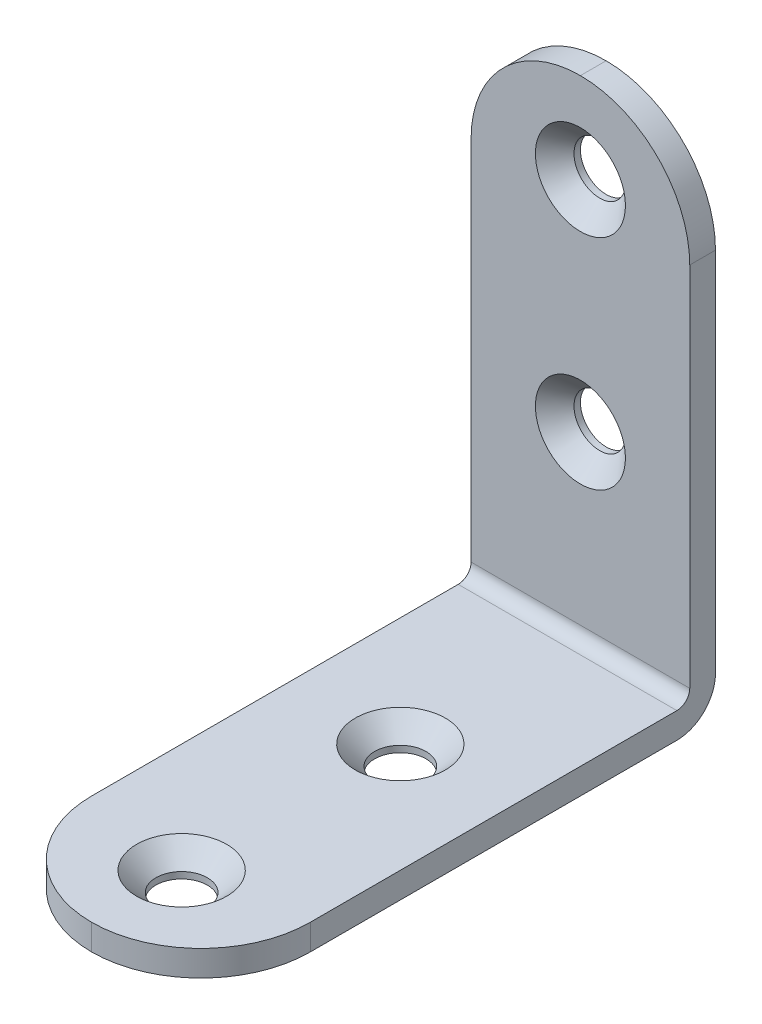
ISO-10303-21;
HEADER;
FILE_DESCRIPTION(('STEP AP214'),'2;1');
FILE_NAME('part.step','',(''),(''),'','','');
FILE_SCHEMA(('AUTOMOTIVE_DESIGN { 1 0 10303 214 1 1 1 1 }'));
ENDSEC;
DATA;
#1=APPLICATION_CONTEXT('core data for automotive mechanical design processes');
#2=APPLICATION_PROTOCOL_DEFINITION('international standard','automotive_design',2000,#1);
#3=PRODUCT_CONTEXT('',#1,'mechanical');
#4=PRODUCT('Part','Part','',(#3));
#5=PRODUCT_RELATED_PRODUCT_CATEGORY('part','',(#4));
#6=PRODUCT_DEFINITION_FORMATION('','',#4);
#7=PRODUCT_DEFINITION_CONTEXT('part definition',#1,'design');
#8=PRODUCT_DEFINITION('design','',#6,#7);
#9=PRODUCT_DEFINITION_SHAPE('','',#8);
#10=(LENGTH_UNIT() NAMED_UNIT(*) SI_UNIT(.MILLI.,.METRE.));
#11=(NAMED_UNIT(*) PLANE_ANGLE_UNIT() SI_UNIT($,.RADIAN.));
#12=(NAMED_UNIT(*) SI_UNIT($,.STERADIAN.) SOLID_ANGLE_UNIT());
#13=UNCERTAINTY_MEASURE_WITH_UNIT(LENGTH_MEASURE(1.E-05),#10,'distance_accuracy_value','');
#14=(GEOMETRIC_REPRESENTATION_CONTEXT(3) GLOBAL_UNCERTAINTY_ASSIGNED_CONTEXT((#13)) GLOBAL_UNIT_ASSIGNED_CONTEXT((#10,
#11,#12)) REPRESENTATION_CONTEXT('',''));
#15=CARTESIAN_POINT('',(0.,0.,0.));
#16=DIRECTION('',(0.,0.,1.));
#17=DIRECTION('',(1.,0.,0.));
#18=AXIS2_PLACEMENT_3D('',#15,#16,#17);
#19=CARTESIAN_POINT('',(-8.5,2.,40.));
#20=DIRECTION('',(0.,1.,0.));
#21=DIRECTION('',(0.,0.,1.));
#22=AXIS2_PLACEMENT_3D('',#19,#20,#21);
#23=PLANE('',#22);
#24=CARTESIAN_POINT('',(0.,2.,16.));
#25=DIRECTION('',(0.,1.,0.));
#26=DIRECTION('',(0.,0.,1.));
#27=AXIS2_PLACEMENT_3D('',#24,#25,#26);
#28=CIRCLE('',#27,3.49999999999999);
#29=CARTESIAN_POINT('',(0.,2.,19.5));
#30=VERTEX_POINT('',#29);
#31=EDGE_CURVE('E211',#30,#30,#28,.F.);
#32=ORIENTED_EDGE('',*,*,#31,.T.);
#33=EDGE_LOOP('',(#32));
#34=FACE_BOUND('',#33,.T.);
#35=CARTESIAN_POINT('',(0.,2.,33.));
#36=DIRECTION('',(0.,1.,0.));
#37=DIRECTION('',(0.,0.,1.));
#38=AXIS2_PLACEMENT_3D('',#35,#36,#37);
#39=CIRCLE('',#38,3.49999999999999);
#40=CARTESIAN_POINT('',(0.,2.,36.5));
#41=VERTEX_POINT('',#40);
#42=EDGE_CURVE('E208',#41,#41,#39,.F.);
#43=ORIENTED_EDGE('',*,*,#42,.T.);
#44=EDGE_LOOP('',(#43));
#45=FACE_BOUND('',#44,.T.);
#46=CARTESIAN_POINT('',(0.,2.,31.5));
#47=DIRECTION('',(0.,1.,0.));
#48=DIRECTION('',(0.,0.,1.));
#49=AXIS2_PLACEMENT_3D('',#46,#47,#48);
#50=CIRCLE('',#49,8.5);
#51=CARTESIAN_POINT('',(-8.5,2.,31.5));
#52=VERTEX_POINT('',#51);
#53=CARTESIAN_POINT('',(0.,2.,40.));
#54=VERTEX_POINT('',#53);
#55=EDGE_CURVE('E50',#52,#54,#50,.T.);
#56=ORIENTED_EDGE('',*,*,#55,.T.);
#57=CARTESIAN_POINT('',(0.,2.,31.5));
#58=DIRECTION('',(0.,1.,0.));
#59=DIRECTION('',(0.,0.,1.));
#60=AXIS2_PLACEMENT_3D('',#57,#58,#59);
#61=CIRCLE('',#60,8.5);
#62=CARTESIAN_POINT('',(8.5,2.,31.5));
#63=VERTEX_POINT('',#62);
#64=EDGE_CURVE('E198',#54,#63,#61,.T.);
#65=ORIENTED_EDGE('',*,*,#64,.T.);
#66=DIRECTION('',(0.,0.,1.));
#67=VECTOR('',#66,1.);
#68=CARTESIAN_POINT('',(8.5,2.,40.));
#69=LINE('',#68,#67);
#70=CARTESIAN_POINT('',(8.5,2.,3.));
#71=VERTEX_POINT('',#70);
#72=EDGE_CURVE('E146',#71,#63,#69,.T.);
#73=ORIENTED_EDGE('',*,*,#72,.F.);
#74=DIRECTION('',(1.,0.,0.));
#75=VECTOR('',#74,1.);
#76=CARTESIAN_POINT('',(-8.5,2.,3.));
#77=LINE('',#76,#75);
#78=CARTESIAN_POINT('',(-8.5,2.,3.));
#79=VERTEX_POINT('',#78);
#80=EDGE_CURVE('E160',#79,#71,#77,.T.);
#81=ORIENTED_EDGE('',*,*,#80,.F.);
#82=DIRECTION('',(0.,0.,1.));
#83=VECTOR('',#82,1.);
#84=CARTESIAN_POINT('',(-8.5,2.,40.));
#85=LINE('',#84,#83);
#86=EDGE_CURVE('E134',#79,#52,#85,.T.);
#87=ORIENTED_EDGE('',*,*,#86,.T.);
#88=EDGE_LOOP('',(#56,#65,#73,#81,#87));
#89=FACE_BOUND('',#88,.T.);
#90=ADVANCED_FACE('F35',(#34,#45,#89),#23,.T.);
#91=CARTESIAN_POINT('',(-8.5,3.,3.));
#92=DIRECTION('',(1.,0.,0.));
#93=DIRECTION('',(0.,0.,-1.));
#94=AXIS2_PLACEMENT_3D('',#91,#92,#93);
#95=CYLINDRICAL_SURFACE('',#94,1.);
#96=ORIENTED_EDGE('',*,*,#80,.T.);
#97=CARTESIAN_POINT('',(8.5,3.,3.));
#98=DIRECTION('',(-1.,0.,0.));
#99=DIRECTION('',(0.,0.,-1.));
#100=AXIS2_PLACEMENT_3D('',#97,#98,#99);
#101=CIRCLE('',#100,1.);
#102=CARTESIAN_POINT('',(8.5,3.,2.));
#103=VERTEX_POINT('',#102);
#104=EDGE_CURVE('E143',#103,#71,#101,.T.);
#105=ORIENTED_EDGE('',*,*,#104,.F.);
#106=DIRECTION('',(1.,0.,0.));
#107=VECTOR('',#106,1.);
#108=CARTESIAN_POINT('',(-8.5,3.,2.));
#109=LINE('',#108,#107);
#110=CARTESIAN_POINT('',(-8.5,3.,2.));
#111=VERTEX_POINT('',#110);
#112=EDGE_CURVE('E162',#111,#103,#109,.T.);
#113=ORIENTED_EDGE('',*,*,#112,.F.);
#114=CARTESIAN_POINT('',(-8.5,3.,3.));
#115=DIRECTION('',(-1.,0.,0.));
#116=DIRECTION('',(0.,0.,-1.));
#117=AXIS2_PLACEMENT_3D('',#114,#115,#116);
#118=CIRCLE('',#117,1.);
#119=EDGE_CURVE('E156',#111,#79,#118,.T.);
#120=ORIENTED_EDGE('',*,*,#119,.T.);
#121=EDGE_LOOP('',(#96,#105,#113,#120));
#122=FACE_BOUND('',#121,.T.);
#123=ADVANCED_FACE('F242',(#122),#95,.F.);
#124=CARTESIAN_POINT('',(-8.5,3.,2.));
#125=DIRECTION('',(0.,0.,1.));
#126=DIRECTION('',(0.,-1.,0.));
#127=AXIS2_PLACEMENT_3D('',#124,#125,#126);
#128=PLANE('',#127);
#129=CARTESIAN_POINT('',(0.,16.,2.));
#130=DIRECTION('',(0.,0.,1.));
#131=DIRECTION('',(0.,-1.,0.));
#132=AXIS2_PLACEMENT_3D('',#129,#130,#131);
#133=CIRCLE('',#132,3.49999999999999);
#134=CARTESIAN_POINT('',(3.49999999999999,16.,2.));
#135=VERTEX_POINT('',#134);
#136=EDGE_CURVE('E220',#135,#135,#133,.F.);
#137=ORIENTED_EDGE('',*,*,#136,.T.);
#138=EDGE_LOOP('',(#137));
#139=FACE_BOUND('',#138,.T.);
#140=CARTESIAN_POINT('',(0.,33.,2.));
#141=DIRECTION('',(0.,0.,1.));
#142=DIRECTION('',(0.,-1.,0.));
#143=AXIS2_PLACEMENT_3D('',#140,#141,#142);
#144=CIRCLE('',#143,3.49999999999999);
#145=CARTESIAN_POINT('',(3.49999999999999,33.,2.));
#146=VERTEX_POINT('',#145);
#147=EDGE_CURVE('E217',#146,#146,#144,.F.);
#148=ORIENTED_EDGE('',*,*,#147,.T.);
#149=EDGE_LOOP('',(#148));
#150=FACE_BOUND('',#149,.T.);
#151=DIRECTION('',(0.,-1.,0.));
#152=VECTOR('',#151,1.);
#153=CARTESIAN_POINT('',(8.5,3.,2.));
#154=LINE('',#153,#152);
#155=CARTESIAN_POINT('',(8.5,31.5,2.));
#156=VERTEX_POINT('',#155);
#157=EDGE_CURVE('E139',#156,#103,#154,.T.);
#158=ORIENTED_EDGE('',*,*,#157,.F.);
#159=CARTESIAN_POINT('',(0.,31.5,2.));
#160=DIRECTION('',(0.,0.,1.));
#161=DIRECTION('',(0.,-1.,0.));
#162=AXIS2_PLACEMENT_3D('',#159,#160,#161);
#163=CIRCLE('',#162,8.5);
#164=CARTESIAN_POINT('',(0.,40.,2.));
#165=VERTEX_POINT('',#164);
#166=EDGE_CURVE('E184',#156,#165,#163,.T.);
#167=ORIENTED_EDGE('',*,*,#166,.T.);
#168=CARTESIAN_POINT('',(0.,31.5,2.));
#169=DIRECTION('',(0.,0.,1.));
#170=DIRECTION('',(0.,-1.,0.));
#171=AXIS2_PLACEMENT_3D('',#168,#169,#170);
#172=CIRCLE('',#171,8.5);
#173=CARTESIAN_POINT('',(-8.5,31.5,2.));
#174=VERTEX_POINT('',#173);
#175=EDGE_CURVE('E182',#165,#174,#172,.T.);
#176=ORIENTED_EDGE('',*,*,#175,.T.);
#177=DIRECTION('',(0.,-1.,0.));
#178=VECTOR('',#177,1.);
#179=CARTESIAN_POINT('',(-8.5,3.,2.));
#180=LINE('',#179,#178);
#181=EDGE_CURVE('E154',#174,#111,#180,.T.);
#182=ORIENTED_EDGE('',*,*,#181,.T.);
#183=ORIENTED_EDGE('',*,*,#112,.T.);
#184=EDGE_LOOP('',(#158,#167,#176,#182,#183));
#185=FACE_BOUND('',#184,.T.);
#186=ADVANCED_FACE('F248',(#139,#150,#185),#128,.T.);
#187=CARTESIAN_POINT('',(-8.5,3.,0.));
#188=DIRECTION('',(0.,0.,-1.));
#189=DIRECTION('',(-1.,0.,0.));
#190=AXIS2_PLACEMENT_3D('',#187,#188,#189);
#191=PLANE('',#190);
#192=CARTESIAN_POINT('',(0.,16.,0.));
#193=DIRECTION('',(0.,0.,-1.));
#194=DIRECTION('',(-1.,0.,0.));
#195=AXIS2_PLACEMENT_3D('',#192,#193,#194);
#196=CIRCLE('',#195,2.);
#197=CARTESIAN_POINT('',(-2.,16.,0.));
#198=VERTEX_POINT('',#197);
#199=EDGE_CURVE('E174',#198,#198,#196,.T.);
#200=ORIENTED_EDGE('',*,*,#199,.F.);
#201=EDGE_LOOP('',(#200));
#202=FACE_BOUND('',#201,.T.);
#203=CARTESIAN_POINT('',(0.,33.,0.));
#204=DIRECTION('',(0.,0.,-1.));
#205=DIRECTION('',(-1.,0.,0.));
#206=AXIS2_PLACEMENT_3D('',#203,#204,#205);
#207=CIRCLE('',#206,2.);
#208=CARTESIAN_POINT('',(-2.,33.,0.));
#209=VERTEX_POINT('',#208);
#210=EDGE_CURVE('E171',#209,#209,#207,.T.);
#211=ORIENTED_EDGE('',*,*,#210,.F.);
#212=EDGE_LOOP('',(#211));
#213=FACE_BOUND('',#212,.T.);
#214=CARTESIAN_POINT('',(0.,31.5,0.));
#215=DIRECTION('',(0.,0.,-1.));
#216=DIRECTION('',(-1.,0.,0.));
#217=AXIS2_PLACEMENT_3D('',#214,#215,#216);
#218=CIRCLE('',#217,8.5);
#219=CARTESIAN_POINT('',(-8.5,31.5,0.));
#220=VERTEX_POINT('',#219);
#221=CARTESIAN_POINT('',(0.,40.,0.));
#222=VERTEX_POINT('',#221);
#223=EDGE_CURVE('E186',#220,#222,#218,.T.);
#224=ORIENTED_EDGE('',*,*,#223,.T.);
#225=CARTESIAN_POINT('',(0.,31.5,0.));
#226=DIRECTION('',(0.,0.,-1.));
#227=DIRECTION('',(-1.,0.,0.));
#228=AXIS2_PLACEMENT_3D('',#225,#226,#227);
#229=CIRCLE('',#228,8.5);
#230=CARTESIAN_POINT('',(8.5,31.5,0.));
#231=VERTEX_POINT('',#230);
#232=EDGE_CURVE('E188',#222,#231,#229,.T.);
#233=ORIENTED_EDGE('',*,*,#232,.T.);
#234=DIRECTION('',(0.,1.,0.));
#235=VECTOR('',#234,1.);
#236=CARTESIAN_POINT('',(8.5,3.,0.));
#237=LINE('',#236,#235);
#238=CARTESIAN_POINT('',(8.5,3.,0.));
#239=VERTEX_POINT('',#238);
#240=EDGE_CURVE('E137',#239,#231,#237,.T.);
#241=ORIENTED_EDGE('',*,*,#240,.F.);
#242=DIRECTION('',(1.,0.,0.));
#243=VECTOR('',#242,1.);
#244=CARTESIAN_POINT('',(-8.5,3.,0.));
#245=LINE('',#244,#243);
#246=CARTESIAN_POINT('',(-8.5,3.,0.));
#247=VERTEX_POINT('',#246);
#248=EDGE_CURVE('E133',#247,#239,#245,.T.);
#249=ORIENTED_EDGE('',*,*,#248,.F.);
#250=DIRECTION('',(0.,1.,0.));
#251=VECTOR('',#250,1.);
#252=CARTESIAN_POINT('',(-8.5,3.,0.));
#253=LINE('',#252,#251);
#254=EDGE_CURVE('E151',#247,#220,#253,.T.);
#255=ORIENTED_EDGE('',*,*,#254,.T.);
#256=EDGE_LOOP('',(#224,#233,#241,#249,#255));
#257=FACE_BOUND('',#256,.T.);
#258=ADVANCED_FACE('F258',(#202,#213,#257),#191,.T.);
#259=CARTESIAN_POINT('',(-8.5,3.,3.));
#260=DIRECTION('',(1.,0.,0.));
#261=DIRECTION('',(0.,0.,-1.));
#262=AXIS2_PLACEMENT_3D('',#259,#260,#261);
#263=CYLINDRICAL_SURFACE('',#262,3.);
#264=ORIENTED_EDGE('',*,*,#248,.T.);
#265=CARTESIAN_POINT('',(8.5,3.,3.));
#266=DIRECTION('',(1.,0.,0.));
#267=DIRECTION('',(0.,0.,-1.));
#268=AXIS2_PLACEMENT_3D('',#265,#266,#267);
#269=CIRCLE('',#268,3.);
#270=CARTESIAN_POINT('',(8.5,0.,3.));
#271=VERTEX_POINT('',#270);
#272=EDGE_CURVE('E118',#271,#239,#269,.T.);
#273=ORIENTED_EDGE('',*,*,#272,.F.);
#274=DIRECTION('',(1.,0.,0.));
#275=VECTOR('',#274,1.);
#276=CARTESIAN_POINT('',(-8.5,0.,3.));
#277=LINE('',#276,#275);
#278=CARTESIAN_POINT('',(-8.5,0.,3.));
#279=VERTEX_POINT('',#278);
#280=EDGE_CURVE('E126',#279,#271,#277,.T.);
#281=ORIENTED_EDGE('',*,*,#280,.F.);
#282=CARTESIAN_POINT('',(-8.5,3.,3.));
#283=DIRECTION('',(1.,0.,0.));
#284=DIRECTION('',(0.,0.,-1.));
#285=AXIS2_PLACEMENT_3D('',#282,#283,#284);
#286=CIRCLE('',#285,3.);
#287=EDGE_CURVE('E149',#279,#247,#286,.T.);
#288=ORIENTED_EDGE('',*,*,#287,.T.);
#289=EDGE_LOOP('',(#264,#273,#281,#288));
#290=FACE_BOUND('',#289,.T.);
#291=ADVANCED_FACE('F136',(#290),#263,.T.);
#292=CARTESIAN_POINT('',(-8.5,0.,40.));
#293=DIRECTION('',(0.,-1.,0.));
#294=DIRECTION('',(0.,0.,-1.));
#295=AXIS2_PLACEMENT_3D('',#292,#293,#294);
#296=PLANE('',#295);
#297=CARTESIAN_POINT('',(0.,0.,16.));
#298=DIRECTION('',(0.,-1.,0.));
#299=DIRECTION('',(0.,0.,-1.));
#300=AXIS2_PLACEMENT_3D('',#297,#298,#299);
#301=CIRCLE('',#300,2.);
#302=CARTESIAN_POINT('',(0.,0.,14.));
#303=VERTEX_POINT('',#302);
#304=EDGE_CURVE('E168',#303,#303,#301,.T.);
#305=ORIENTED_EDGE('',*,*,#304,.F.);
#306=EDGE_LOOP('',(#305));
#307=FACE_BOUND('',#306,.T.);
#308=CARTESIAN_POINT('',(0.,0.,33.));
#309=DIRECTION('',(0.,-1.,0.));
#310=DIRECTION('',(0.,0.,-1.));
#311=AXIS2_PLACEMENT_3D('',#308,#309,#310);
#312=CIRCLE('',#311,2.);
#313=CARTESIAN_POINT('',(0.,0.,31.));
#314=VERTEX_POINT('',#313);
#315=EDGE_CURVE('E123',#314,#314,#312,.T.);
#316=ORIENTED_EDGE('',*,*,#315,.F.);
#317=EDGE_LOOP('',(#316));
#318=FACE_BOUND('',#317,.T.);
#319=DIRECTION('',(0.,0.,-1.));
#320=VECTOR('',#319,1.);
#321=CARTESIAN_POINT('',(8.5,0.,40.));
#322=LINE('',#321,#320);
#323=CARTESIAN_POINT('',(8.5,0.,31.5));
#324=VERTEX_POINT('',#323);
#325=EDGE_CURVE('E113',#324,#271,#322,.T.);
#326=ORIENTED_EDGE('',*,*,#325,.F.);
#327=CARTESIAN_POINT('',(0.,0.,31.5));
#328=DIRECTION('',(0.,-1.,0.));
#329=DIRECTION('',(0.,0.,-1.));
#330=AXIS2_PLACEMENT_3D('',#327,#328,#329);
#331=CIRCLE('',#330,8.5);
#332=CARTESIAN_POINT('',(0.,0.,40.));
#333=VERTEX_POINT('',#332);
#334=EDGE_CURVE('E58',#324,#333,#331,.T.);
#335=ORIENTED_EDGE('',*,*,#334,.T.);
#336=CARTESIAN_POINT('',(0.,0.,31.5));
#337=DIRECTION('',(0.,-1.,0.));
#338=DIRECTION('',(0.,0.,-1.));
#339=AXIS2_PLACEMENT_3D('',#336,#337,#338);
#340=CIRCLE('',#339,8.5);
#341=CARTESIAN_POINT('',(-8.5,0.,31.5));
#342=VERTEX_POINT('',#341);
#343=EDGE_CURVE('E194',#333,#342,#340,.T.);
#344=ORIENTED_EDGE('',*,*,#343,.T.);
#345=DIRECTION('',(0.,0.,-1.));
#346=VECTOR('',#345,1.);
#347=CARTESIAN_POINT('',(-8.5,0.,40.));
#348=LINE('',#347,#346);
#349=EDGE_CURVE('E129',#342,#279,#348,.T.);
#350=ORIENTED_EDGE('',*,*,#349,.T.);
#351=ORIENTED_EDGE('',*,*,#280,.T.);
#352=EDGE_LOOP('',(#326,#335,#344,#350,#351));
#353=FACE_BOUND('',#352,.T.);
#354=ADVANCED_FACE('F127',(#307,#318,#353),#296,.T.);
#355=CARTESIAN_POINT('',(-8.5,3.,3.));
#356=DIRECTION('',(1.,0.,0.));
#357=DIRECTION('',(0.,0.,-1.));
#358=AXIS2_PLACEMENT_3D('',#355,#356,#357);
#359=PLANE('',#358);
#360=ORIENTED_EDGE('',*,*,#181,.F.);
#361=DIRECTION('',(0.,0.,1.));
#362=VECTOR('',#361,1.);
#363=CARTESIAN_POINT('',(-8.5,31.5,0.));
#364=LINE('',#363,#362);
#365=EDGE_CURVE('E192',#174,#220,#364,.F.);
#366=ORIENTED_EDGE('',*,*,#365,.T.);
#367=ORIENTED_EDGE('',*,*,#254,.F.);
#368=ORIENTED_EDGE('',*,*,#287,.F.);
#369=ORIENTED_EDGE('',*,*,#349,.F.);
#370=DIRECTION('',(0.,-1.,0.));
#371=VECTOR('',#370,1.);
#372=CARTESIAN_POINT('',(-8.5,2.,31.5));
#373=LINE('',#372,#371);
#374=EDGE_CURVE('E190',#342,#52,#373,.F.);
#375=ORIENTED_EDGE('',*,*,#374,.T.);
#376=ORIENTED_EDGE('',*,*,#86,.F.);
#377=ORIENTED_EDGE('',*,*,#119,.F.);
#378=EDGE_LOOP('',(#360,#366,#367,#368,#369,#375,#376,#377));
#379=FACE_BOUND('',#378,.T.);
#380=ADVANCED_FACE('F253',(#379),#359,.F.);
#381=CARTESIAN_POINT('',(8.5,3.,3.));
#382=DIRECTION('',(1.,0.,0.));
#383=DIRECTION('',(0.,0.,-1.));
#384=AXIS2_PLACEMENT_3D('',#381,#382,#383);
#385=PLANE('',#384);
#386=ORIENTED_EDGE('',*,*,#240,.T.);
#387=DIRECTION('',(0.,0.,1.));
#388=VECTOR('',#387,1.);
#389=CARTESIAN_POINT('',(8.5,31.5,3.));
#390=LINE('',#389,#388);
#391=EDGE_CURVE('E179',#231,#156,#390,.T.);
#392=ORIENTED_EDGE('',*,*,#391,.T.);
#393=ORIENTED_EDGE('',*,*,#157,.T.);
#394=ORIENTED_EDGE('',*,*,#104,.T.);
#395=ORIENTED_EDGE('',*,*,#72,.T.);
#396=DIRECTION('',(0.,-1.,0.));
#397=VECTOR('',#396,1.);
#398=CARTESIAN_POINT('',(8.5,3.,31.5));
#399=LINE('',#398,#397);
#400=EDGE_CURVE('E122',#63,#324,#399,.T.);
#401=ORIENTED_EDGE('',*,*,#400,.T.);
#402=ORIENTED_EDGE('',*,*,#325,.T.);
#403=ORIENTED_EDGE('',*,*,#272,.T.);
#404=EDGE_LOOP('',(#386,#392,#393,#394,#395,#401,#402,#403));
#405=FACE_BOUND('',#404,.T.);
#406=ADVANCED_FACE('F116',(#405),#385,.T.);
#407=CARTESIAN_POINT('',(0.,-13.5,33.));
#408=DIRECTION('',(0.,1.,0.));
#409=DIRECTION('',(0.,0.,1.));
#410=AXIS2_PLACEMENT_3D('',#407,#408,#409);
#411=CYLINDRICAL_SURFACE('',#410,2.);
#412=CARTESIAN_POINT('',(0.,0.500000000000013,33.));
#413=DIRECTION('',(0.,1.,0.));
#414=DIRECTION('',(0.,0.,1.));
#415=AXIS2_PLACEMENT_3D('',#412,#413,#414);
#416=CIRCLE('',#415,2.);
#417=CARTESIAN_POINT('',(0.,0.500000000000012,35.));
#418=VERTEX_POINT('',#417);
#419=EDGE_CURVE('E11',#418,#418,#416,.T.);
#420=ORIENTED_EDGE('',*,*,#419,.T.);
#421=EDGE_LOOP('',(#420));
#422=FACE_BOUND('',#421,.T.);
#423=ORIENTED_EDGE('',*,*,#315,.T.);
#424=EDGE_LOOP('',(#423));
#425=FACE_BOUND('',#424,.T.);
#426=ADVANCED_FACE('F296',(#422,#425),#411,.F.);
#427=CARTESIAN_POINT('',(0.,-13.5,16.));
#428=DIRECTION('',(0.,1.,0.));
#429=DIRECTION('',(0.,0.,1.));
#430=AXIS2_PLACEMENT_3D('',#427,#428,#429);
#431=CYLINDRICAL_SURFACE('',#430,2.);
#432=CARTESIAN_POINT('',(0.,0.500000000000014,16.));
#433=DIRECTION('',(0.,1.,0.));
#434=DIRECTION('',(0.,0.,1.));
#435=AXIS2_PLACEMENT_3D('',#432,#433,#434);
#436=CIRCLE('',#435,2.);
#437=CARTESIAN_POINT('',(0.,0.500000000000014,18.));
#438=VERTEX_POINT('',#437);
#439=EDGE_CURVE('E200',#438,#438,#436,.T.);
#440=ORIENTED_EDGE('',*,*,#439,.T.);
#441=EDGE_LOOP('',(#440));
#442=FACE_BOUND('',#441,.T.);
#443=ORIENTED_EDGE('',*,*,#304,.T.);
#444=EDGE_LOOP('',(#443));
#445=FACE_BOUND('',#444,.T.);
#446=ADVANCED_FACE('F293',(#442,#445),#431,.F.);
#447=CARTESIAN_POINT('',(0.,33.,-13.5));
#448=DIRECTION('',(0.,0.,1.));
#449=DIRECTION('',(1.,0.,0.));
#450=AXIS2_PLACEMENT_3D('',#447,#448,#449);
#451=CYLINDRICAL_SURFACE('',#450,2.);
#452=CARTESIAN_POINT('',(0.,33.,0.500000000000013));
#453=DIRECTION('',(0.,0.,1.));
#454=DIRECTION('',(1.,0.,0.));
#455=AXIS2_PLACEMENT_3D('',#452,#453,#454);
#456=CIRCLE('',#455,2.);
#457=CARTESIAN_POINT('',(2.,33.,0.500000000000012));
#458=VERTEX_POINT('',#457);
#459=EDGE_CURVE('E43',#458,#458,#456,.T.);
#460=ORIENTED_EDGE('',*,*,#459,.T.);
#461=EDGE_LOOP('',(#460));
#462=FACE_BOUND('',#461,.T.);
#463=ORIENTED_EDGE('',*,*,#210,.T.);
#464=EDGE_LOOP('',(#463));
#465=FACE_BOUND('',#464,.T.);
#466=ADVANCED_FACE('F225',(#462,#465),#451,.F.);
#467=CARTESIAN_POINT('',(0.,16.,-13.5));
#468=DIRECTION('',(0.,0.,1.));
#469=DIRECTION('',(1.,0.,0.));
#470=AXIS2_PLACEMENT_3D('',#467,#468,#469);
#471=CYLINDRICAL_SURFACE('',#470,2.);
#472=CARTESIAN_POINT('',(0.,16.,0.500000000000013));
#473=DIRECTION('',(0.,0.,1.));
#474=DIRECTION('',(1.,0.,0.));
#475=AXIS2_PLACEMENT_3D('',#472,#473,#474);
#476=CIRCLE('',#475,2.);
#477=CARTESIAN_POINT('',(2.,16.,0.500000000000012));
#478=VERTEX_POINT('',#477);
#479=EDGE_CURVE('E214',#478,#478,#476,.T.);
#480=ORIENTED_EDGE('',*,*,#479,.T.);
#481=EDGE_LOOP('',(#480));
#482=FACE_BOUND('',#481,.T.);
#483=ORIENTED_EDGE('',*,*,#199,.T.);
#484=EDGE_LOOP('',(#483));
#485=FACE_BOUND('',#484,.T.);
#486=ADVANCED_FACE('F276',(#482,#485),#471,.F.);
#487=CARTESIAN_POINT('',(0.,31.5,0.));
#488=DIRECTION('',(0.,0.,-1.));
#489=DIRECTION('',(-1.,0.,0.));
#490=AXIS2_PLACEMENT_3D('',#487,#488,#489);
#491=CYLINDRICAL_SURFACE('',#490,8.5);
#492=DIRECTION('',(0.,0.,1.));
#493=VECTOR('',#492,1.);
#494=CARTESIAN_POINT('',(0.,40.,2.));
#495=LINE('',#494,#493);
#496=EDGE_CURVE('E177',#222,#165,#495,.T.);
#497=ORIENTED_EDGE('',*,*,#496,.F.);
#498=ORIENTED_EDGE('',*,*,#223,.F.);
#499=ORIENTED_EDGE('',*,*,#365,.F.);
#500=ORIENTED_EDGE('',*,*,#175,.F.);
#501=EDGE_LOOP('',(#497,#498,#499,#500));
#502=FACE_BOUND('',#501,.T.);
#503=ADVANCED_FACE('F272',(#502),#491,.T.);
#504=CARTESIAN_POINT('',(0.,31.5,3.));
#505=DIRECTION('',(0.,0.,1.));
#506=DIRECTION('',(1.,0.,0.));
#507=AXIS2_PLACEMENT_3D('',#504,#505,#506);
#508=CYLINDRICAL_SURFACE('',#507,8.5);
#509=ORIENTED_EDGE('',*,*,#232,.F.);
#510=ORIENTED_EDGE('',*,*,#496,.T.);
#511=ORIENTED_EDGE('',*,*,#166,.F.);
#512=ORIENTED_EDGE('',*,*,#391,.F.);
#513=EDGE_LOOP('',(#509,#510,#511,#512));
#514=FACE_BOUND('',#513,.T.);
#515=ADVANCED_FACE('F268',(#514),#508,.T.);
#516=CARTESIAN_POINT('',(0.,0.,31.5));
#517=DIRECTION('',(0.,1.,0.));
#518=DIRECTION('',(0.,0.,1.));
#519=AXIS2_PLACEMENT_3D('',#516,#517,#518);
#520=CYLINDRICAL_SURFACE('',#519,8.5);
#521=DIRECTION('',(0.,-1.,0.));
#522=VECTOR('',#521,1.);
#523=CARTESIAN_POINT('',(0.,0.,40.));
#524=LINE('',#523,#522);
#525=EDGE_CURVE('E203',#54,#333,#524,.T.);
#526=ORIENTED_EDGE('',*,*,#525,.F.);
#527=ORIENTED_EDGE('',*,*,#55,.F.);
#528=ORIENTED_EDGE('',*,*,#374,.F.);
#529=ORIENTED_EDGE('',*,*,#343,.F.);
#530=EDGE_LOOP('',(#526,#527,#528,#529));
#531=FACE_BOUND('',#530,.T.);
#532=ADVANCED_FACE('F271',(#531),#520,.T.);
#533=CARTESIAN_POINT('',(0.,3.,31.5));
#534=DIRECTION('',(0.,-1.,0.));
#535=DIRECTION('',(0.,0.,-1.));
#536=AXIS2_PLACEMENT_3D('',#533,#534,#535);
#537=CYLINDRICAL_SURFACE('',#536,8.5);
#538=ORIENTED_EDGE('',*,*,#64,.F.);
#539=ORIENTED_EDGE('',*,*,#525,.T.);
#540=ORIENTED_EDGE('',*,*,#334,.F.);
#541=ORIENTED_EDGE('',*,*,#400,.F.);
#542=EDGE_LOOP('',(#538,#539,#540,#541));
#543=FACE_BOUND('',#542,.T.);
#544=ADVANCED_FACE('F278',(#543),#537,.T.);
#545=CARTESIAN_POINT('',(0.,0.500000000000014,16.));
#546=DIRECTION('',(0.,1.,0.));
#547=DIRECTION('',(0.,0.,1.));
#548=AXIS2_PLACEMENT_3D('',#545,#546,#547);
#549=CONICAL_SURFACE('',#548,2.,0.785398163397449);
#550=ORIENTED_EDGE('',*,*,#31,.F.);
#551=EDGE_LOOP('',(#550));
#552=FACE_BOUND('',#551,.T.);
#553=ORIENTED_EDGE('',*,*,#439,.F.);
#554=EDGE_LOOP('',(#553));
#555=FACE_BOUND('',#554,.T.);
#556=ADVANCED_FACE('F237',(#552,#555),#549,.F.);
#557=CARTESIAN_POINT('',(0.,16.,0.500000000000013));
#558=DIRECTION('',(0.,0.,1.));
#559=DIRECTION('',(1.,0.,0.));
#560=AXIS2_PLACEMENT_3D('',#557,#558,#559);
#561=CONICAL_SURFACE('',#560,2.,0.785398163397448);
#562=CARTESIAN_POINT('',(3.49999999999999,16.,2.));
#563=CARTESIAN_POINT('',(3.48437499999999,16.,1.984375));
#564=CARTESIAN_POINT('',(3.46874999999999,16.,1.96875));
#565=CARTESIAN_POINT('',(3.43749999999999,16.,1.9375));
#566=CARTESIAN_POINT('',(3.42187499999999,16.,1.921875));
#567=CARTESIAN_POINT('',(3.39062499999999,16.,1.890625));
#568=CARTESIAN_POINT('',(3.37499999999999,16.,1.875));
#569=CARTESIAN_POINT('',(3.34374999999999,16.,1.84375));
#570=CARTESIAN_POINT('',(3.32812499999999,16.,1.828125));
#571=CARTESIAN_POINT('',(3.29687499999999,16.,1.796875));
#572=CARTESIAN_POINT('',(3.28124999999999,16.,1.78125));
#573=CARTESIAN_POINT('',(3.24999999999999,16.,1.75));
#574=CARTESIAN_POINT('',(3.23437499999999,16.,1.734375));
#575=CARTESIAN_POINT('',(3.20312499999999,16.,1.703125));
#576=CARTESIAN_POINT('',(3.18749999999999,16.,1.6875));
#577=CARTESIAN_POINT('',(3.15624999999999,16.,1.65625));
#578=CARTESIAN_POINT('',(3.14062499999999,16.,1.640625));
#579=CARTESIAN_POINT('',(3.10937499999999,16.,1.609375));
#580=CARTESIAN_POINT('',(3.09374999999999,16.,1.59375));
#581=CARTESIAN_POINT('',(3.06249999999999,16.,1.5625));
#582=CARTESIAN_POINT('',(3.04687499999999,16.,1.546875));
#583=CARTESIAN_POINT('',(3.01562499999999,16.,1.515625));
#584=CARTESIAN_POINT('',(2.99999999999999,16.,1.5));
#585=CARTESIAN_POINT('',(2.96874999999999,16.,1.46875));
#586=CARTESIAN_POINT('',(2.95312499999999,16.,1.453125));
#587=CARTESIAN_POINT('',(2.92187499999999,16.,1.421875));
#588=CARTESIAN_POINT('',(2.90624999999999,16.,1.40625));
#589=CARTESIAN_POINT('',(2.87499999999999,16.,1.375));
#590=CARTESIAN_POINT('',(2.85937499999999,16.,1.359375));
#591=CARTESIAN_POINT('',(2.82812499999999,16.,1.32812500000001));
#592=CARTESIAN_POINT('',(2.81249999999999,16.,1.31250000000001));
#593=CARTESIAN_POINT('',(2.78124999999999,16.,1.28125000000001));
#594=CARTESIAN_POINT('',(2.765625,16.,1.26562500000001));
#595=CARTESIAN_POINT('',(2.734375,16.,1.23437500000001));
#596=CARTESIAN_POINT('',(2.71875,16.,1.21875000000001));
#597=CARTESIAN_POINT('',(2.6875,16.,1.18750000000001));
#598=CARTESIAN_POINT('',(2.671875,16.,1.17187500000001));
#599=CARTESIAN_POINT('',(2.640625,16.,1.14062500000001));
#600=CARTESIAN_POINT('',(2.625,16.,1.12500000000001));
#601=CARTESIAN_POINT('',(2.59375,16.,1.09375000000001));
#602=CARTESIAN_POINT('',(2.578125,16.,1.07812500000001));
#603=CARTESIAN_POINT('',(2.546875,16.,1.04687500000001));
#604=CARTESIAN_POINT('',(2.53125,16.,1.03125000000001));
#605=CARTESIAN_POINT('',(2.5,16.,1.00000000000001));
#606=CARTESIAN_POINT('',(2.484375,16.,0.984375000000008));
#607=CARTESIAN_POINT('',(2.453125,16.,0.953125000000009));
#608=CARTESIAN_POINT('',(2.4375,16.,0.937500000000009));
#609=CARTESIAN_POINT('',(2.40625,16.,0.906250000000009));
#610=CARTESIAN_POINT('',(2.390625,16.,0.890625000000009));
#611=CARTESIAN_POINT('',(2.359375,16.,0.85937500000001));
#612=CARTESIAN_POINT('',(2.34375,16.,0.84375000000001));
#613=CARTESIAN_POINT('',(2.3125,16.,0.81250000000001));
#614=CARTESIAN_POINT('',(2.296875,16.,0.79687500000001));
#615=CARTESIAN_POINT('',(2.265625,16.,0.76562500000001));
#616=CARTESIAN_POINT('',(2.25,16.,0.750000000000011));
#617=CARTESIAN_POINT('',(2.21875,16.,0.718750000000011));
#618=CARTESIAN_POINT('',(2.203125,16.,0.703125000000011));
#619=CARTESIAN_POINT('',(2.171875,16.,0.671875000000011));
#620=CARTESIAN_POINT('',(2.15625,16.,0.656250000000011));
#621=CARTESIAN_POINT('',(2.125,16.,0.625000000000012));
#622=CARTESIAN_POINT('',(2.109375,16.,0.609375000000012));
#623=CARTESIAN_POINT('',(2.078125,16.,0.578125000000012));
#624=CARTESIAN_POINT('',(2.0625,16.,0.562500000000012));
#625=CARTESIAN_POINT('',(2.03125,16.,0.531250000000012));
#626=CARTESIAN_POINT('',(2.015625,16.,0.515625000000013));
#627=CARTESIAN_POINT('',(2.,16.,0.500000000000013));
#628=B_SPLINE_CURVE_WITH_KNOTS('',3,(#562,#563,#564,#565,#566,#567,#568,#569,#570,#571,#572,
#573,#574,#575,#576,#577,#578,#579,#580,#581,#582,#583,#584,#585,#586,#587,#588,#589,#590,#591,
#592,#593,#594,#595,#596,#597,#598,#599,#600,#601,#602,#603,#604,#605,#606,#607,#608,#609,#610,
#611,#612,#613,#614,#615,#616,#617,#618,#619,#620,#621,#622,#623,#624,#625,#626,#627),
.UNSPECIFIED.,.F.,.F.,(4,2,2,2,2,2,2,2,2,2,2,2,2,2,2,2,2,2,2,2,2,2,2,2,2,2,2,2,2,2,2,2,4),(0.,
0.0662912607362381,0.132582521472476,0.198873782208715,0.265165042944953,0.331456303681191,
0.397747564417429,0.464038825153668,0.530330085889906,0.596621346626144,0.662912607362382,
0.729203868098621,0.795495128834859,0.861786389571097,0.928077650307335,0.994368911043574,
1.06066017177981,1.12695143251605,1.19324269325229,1.25953395398853,1.32582521472476,
1.392116475461,1.45840773619724,1.52469899693348,1.59099025766972,1.65728151840596,
1.72357277914219,1.78986403987843,1.85615530061467,1.92244656135091,1.98873782208715,
2.05502908282338,2.12132034355962),.UNSPECIFIED.);
#629=EDGE_CURVE('BSEAM230',#135,#478,#628,.T.);
#630=ORIENTED_EDGE('',*,*,#136,.F.);
#631=ORIENTED_EDGE('',*,*,#479,.F.);
#632=ORIENTED_EDGE('',*,*,#629,.T.);
#633=ORIENTED_EDGE('',*,*,#629,.F.);
#634=EDGE_LOOP('',(#630,#632,#631,#633));
#635=FACE_BOUND('',#634,.T.);
#636=ADVANCED_FACE('F230',(#635),#561,.F.);
#637=CARTESIAN_POINT('',(0.,33.,0.500000000000013));
#638=DIRECTION('',(0.,0.,1.));
#639=DIRECTION('',(1.,0.,0.));
#640=AXIS2_PLACEMENT_3D('',#637,#638,#639);
#641=CONICAL_SURFACE('',#640,2.,0.785398163397449);
#642=CARTESIAN_POINT('',(3.49999999999999,33.,2.));
#643=CARTESIAN_POINT('',(3.48437499999999,33.,1.984375));
#644=CARTESIAN_POINT('',(3.46874999999999,33.,1.96875));
#645=CARTESIAN_POINT('',(3.43749999999999,33.,1.9375));
#646=CARTESIAN_POINT('',(3.42187499999999,33.,1.921875));
#647=CARTESIAN_POINT('',(3.39062499999999,33.,1.890625));
#648=CARTESIAN_POINT('',(3.37499999999999,33.,1.875));
#649=CARTESIAN_POINT('',(3.34374999999999,33.,1.84375));
#650=CARTESIAN_POINT('',(3.32812499999999,33.,1.828125));
#651=CARTESIAN_POINT('',(3.29687499999999,33.,1.796875));
#652=CARTESIAN_POINT('',(3.28124999999999,33.,1.78125));
#653=CARTESIAN_POINT('',(3.24999999999999,33.,1.75));
#654=CARTESIAN_POINT('',(3.23437499999999,33.,1.734375));
#655=CARTESIAN_POINT('',(3.20312499999999,33.,1.703125));
#656=CARTESIAN_POINT('',(3.18749999999999,33.,1.6875));
#657=CARTESIAN_POINT('',(3.15624999999999,33.,1.65625));
#658=CARTESIAN_POINT('',(3.14062499999999,33.,1.640625));
#659=CARTESIAN_POINT('',(3.10937499999999,33.,1.609375));
#660=CARTESIAN_POINT('',(3.09374999999999,33.,1.59375));
#661=CARTESIAN_POINT('',(3.06249999999999,33.,1.5625));
#662=CARTESIAN_POINT('',(3.04687499999999,33.,1.546875));
#663=CARTESIAN_POINT('',(3.01562499999999,33.,1.515625));
#664=CARTESIAN_POINT('',(2.99999999999999,33.,1.5));
#665=CARTESIAN_POINT('',(2.96874999999999,33.,1.46875));
#666=CARTESIAN_POINT('',(2.95312499999999,33.,1.453125));
#667=CARTESIAN_POINT('',(2.92187499999999,33.,1.421875));
#668=CARTESIAN_POINT('',(2.90624999999999,33.,1.40625000000001));
#669=CARTESIAN_POINT('',(2.87499999999999,33.,1.37500000000001));
#670=CARTESIAN_POINT('',(2.85937499999999,33.,1.35937500000001));
#671=CARTESIAN_POINT('',(2.82812499999999,33.,1.32812500000001));
#672=CARTESIAN_POINT('',(2.81249999999999,33.,1.31250000000001));
#673=CARTESIAN_POINT('',(2.78124999999999,33.,1.28125000000001));
#674=CARTESIAN_POINT('',(2.765625,33.,1.26562500000001));
#675=CARTESIAN_POINT('',(2.734375,33.,1.23437500000001));
#676=CARTESIAN_POINT('',(2.71875,33.,1.21875000000001));
#677=CARTESIAN_POINT('',(2.6875,33.,1.18750000000001));
#678=CARTESIAN_POINT('',(2.671875,33.,1.17187500000001));
#679=CARTESIAN_POINT('',(2.640625,33.,1.14062500000001));
#680=CARTESIAN_POINT('',(2.625,33.,1.12500000000001));
#681=CARTESIAN_POINT('',(2.59375,33.,1.09375000000001));
#682=CARTESIAN_POINT('',(2.578125,33.,1.07812500000001));
#683=CARTESIAN_POINT('',(2.546875,33.,1.04687500000001));
#684=CARTESIAN_POINT('',(2.53125,33.,1.03125000000001));
#685=CARTESIAN_POINT('',(2.5,33.,1.00000000000001));
#686=CARTESIAN_POINT('',(2.484375,33.,0.984375000000008));
#687=CARTESIAN_POINT('',(2.453125,33.,0.953125000000009));
#688=CARTESIAN_POINT('',(2.4375,33.,0.937500000000009));
#689=CARTESIAN_POINT('',(2.40625,33.,0.906250000000009));
#690=CARTESIAN_POINT('',(2.390625,33.,0.890625000000009));
#691=CARTESIAN_POINT('',(2.359375,33.,0.85937500000001));
#692=CARTESIAN_POINT('',(2.34375,33.,0.84375000000001));
#693=CARTESIAN_POINT('',(2.3125,33.,0.81250000000001));
#694=CARTESIAN_POINT('',(2.296875,33.,0.79687500000001));
#695=CARTESIAN_POINT('',(2.265625,33.,0.76562500000001));
#696=CARTESIAN_POINT('',(2.25,33.,0.750000000000011));
#697=CARTESIAN_POINT('',(2.21875,33.,0.718750000000011));
#698=CARTESIAN_POINT('',(2.203125,33.,0.703125000000011));
#699=CARTESIAN_POINT('',(2.171875,33.,0.671875000000011));
#700=CARTESIAN_POINT('',(2.15625,33.,0.656250000000011));
#701=CARTESIAN_POINT('',(2.125,33.,0.625000000000012));
#702=CARTESIAN_POINT('',(2.109375,33.,0.609375000000012));
#703=CARTESIAN_POINT('',(2.078125,33.,0.578125000000012));
#704=CARTESIAN_POINT('',(2.0625,33.,0.562500000000012));
#705=CARTESIAN_POINT('',(2.03125,33.,0.531250000000012));
#706=CARTESIAN_POINT('',(2.015625,33.,0.515625000000013));
#707=CARTESIAN_POINT('',(2.,33.,0.500000000000013));
#708=B_SPLINE_CURVE_WITH_KNOTS('',3,(#642,#643,#644,#645,#646,#647,#648,#649,#650,#651,#652,
#653,#654,#655,#656,#657,#658,#659,#660,#661,#662,#663,#664,#665,#666,#667,#668,#669,#670,#671,
#672,#673,#674,#675,#676,#677,#678,#679,#680,#681,#682,#683,#684,#685,#686,#687,#688,#689,#690,
#691,#692,#693,#694,#695,#696,#697,#698,#699,#700,#701,#702,#703,#704,#705,#706,#707),
.UNSPECIFIED.,.F.,.F.,(4,2,2,2,2,2,2,2,2,2,2,2,2,2,2,2,2,2,2,2,2,2,2,2,2,2,2,2,2,2,2,2,4),(0.,
0.0662912607362389,0.132582521472477,0.198873782208715,0.265165042944953,0.331456303681192,
0.39774756441743,0.464038825153668,0.530330085889906,0.596621346626145,0.662912607362383,
0.729203868098621,0.795495128834859,0.861786389571098,0.928077650307336,0.994368911043574,
1.06066017177981,1.12695143251605,1.19324269325229,1.25953395398853,1.32582521472477,
1.392116475461,1.45840773619724,1.52469899693348,1.59099025766972,1.65728151840596,
1.72357277914219,1.78986403987843,1.85615530061467,1.92244656135091,1.98873782208715,
2.05502908282339,2.12132034355962),.UNSPECIFIED.);
#709=EDGE_CURVE('BSEAM228',#146,#458,#708,.T.);
#710=ORIENTED_EDGE('',*,*,#147,.F.);
#711=ORIENTED_EDGE('',*,*,#459,.F.);
#712=ORIENTED_EDGE('',*,*,#709,.T.);
#713=ORIENTED_EDGE('',*,*,#709,.F.);
#714=EDGE_LOOP('',(#710,#712,#711,#713));
#715=FACE_BOUND('',#714,.T.);
#716=ADVANCED_FACE('F228',(#715),#641,.F.);
#717=CARTESIAN_POINT('',(0.,0.500000000000013,33.));
#718=DIRECTION('',(0.,1.,0.));
#719=DIRECTION('',(0.,0.,1.));
#720=AXIS2_PLACEMENT_3D('',#717,#718,#719);
#721=CONICAL_SURFACE('',#720,2.,0.785398163397448);
#722=CARTESIAN_POINT('',(0.,2.,36.5));
#723=CARTESIAN_POINT('',(0.,1.984375,36.484375));
#724=CARTESIAN_POINT('',(0.,1.96875,36.46875));
#725=CARTESIAN_POINT('',(0.,1.9375,36.4375));
#726=CARTESIAN_POINT('',(0.,1.921875,36.421875));
#727=CARTESIAN_POINT('',(0.,1.890625,36.390625));
#728=CARTESIAN_POINT('',(0.,1.875,36.375));
#729=CARTESIAN_POINT('',(0.,1.84375,36.34375));
#730=CARTESIAN_POINT('',(0.,1.828125,36.328125));
#731=CARTESIAN_POINT('',(0.,1.796875,36.296875));
#732=CARTESIAN_POINT('',(0.,1.78125,36.28125));
#733=CARTESIAN_POINT('',(0.,1.75,36.25));
#734=CARTESIAN_POINT('',(0.,1.734375,36.234375));
#735=CARTESIAN_POINT('',(0.,1.703125,36.203125));
#736=CARTESIAN_POINT('',(0.,1.6875,36.1875));
#737=CARTESIAN_POINT('',(0.,1.65625,36.15625));
#738=CARTESIAN_POINT('',(0.,1.640625,36.140625));
#739=CARTESIAN_POINT('',(0.,1.609375,36.109375));
#740=CARTESIAN_POINT('',(0.,1.59375,36.09375));
#741=CARTESIAN_POINT('',(0.,1.5625,36.0625));
#742=CARTESIAN_POINT('',(0.,1.546875,36.046875));
#743=CARTESIAN_POINT('',(0.,1.515625,36.015625));
#744=CARTESIAN_POINT('',(0.,1.5,36.));
#745=CARTESIAN_POINT('',(0.,1.46875,35.96875));
#746=CARTESIAN_POINT('',(0.,1.453125,35.953125));
#747=CARTESIAN_POINT('',(0.,1.421875,35.921875));
#748=CARTESIAN_POINT('',(0.,1.40625,35.90625));
#749=CARTESIAN_POINT('',(0.,1.37500000000001,35.875));
#750=CARTESIAN_POINT('',(0.,1.35937500000001,35.859375));
#751=CARTESIAN_POINT('',(0.,1.32812500000001,35.828125));
#752=CARTESIAN_POINT('',(0.,1.31250000000001,35.8125));
#753=CARTESIAN_POINT('',(0.,1.28125000000001,35.78125));
#754=CARTESIAN_POINT('',(0.,1.26562500000001,35.765625));
#755=CARTESIAN_POINT('',(0.,1.23437500000001,35.734375));
#756=CARTESIAN_POINT('',(0.,1.21875000000001,35.71875));
#757=CARTESIAN_POINT('',(0.,1.18750000000001,35.6875));
#758=CARTESIAN_POINT('',(0.,1.17187500000001,35.671875));
#759=CARTESIAN_POINT('',(0.,1.14062500000001,35.640625));
#760=CARTESIAN_POINT('',(0.,1.12500000000001,35.625));
#761=CARTESIAN_POINT('',(0.,1.09375000000001,35.59375));
#762=CARTESIAN_POINT('',(0.,1.07812500000001,35.578125));
#763=CARTESIAN_POINT('',(0.,1.04687500000001,35.546875));
#764=CARTESIAN_POINT('',(0.,1.03125000000001,35.53125));
#765=CARTESIAN_POINT('',(0.,1.00000000000001,35.5));
#766=CARTESIAN_POINT('',(0.,0.984375000000008,35.484375));
#767=CARTESIAN_POINT('',(0.,0.953125000000009,35.453125));
#768=CARTESIAN_POINT('',(0.,0.93750000000001,35.4375));
#769=CARTESIAN_POINT('',(0.,0.90625000000001,35.40625));
#770=CARTESIAN_POINT('',(0.,0.890625000000009,35.390625));
#771=CARTESIAN_POINT('',(0.,0.859375000000009,35.359375));
#772=CARTESIAN_POINT('',(0.,0.84375000000001,35.34375));
#773=CARTESIAN_POINT('',(0.,0.81250000000001,35.3125));
#774=CARTESIAN_POINT('',(0.,0.79687500000001,35.296875));
#775=CARTESIAN_POINT('',(0.,0.765625000000011,35.265625));
#776=CARTESIAN_POINT('',(0.,0.750000000000011,35.25));
#777=CARTESIAN_POINT('',(0.,0.718750000000011,35.21875));
#778=CARTESIAN_POINT('',(0.,0.70312500000001,35.203125));
#779=CARTESIAN_POINT('',(0.,0.67187500000001,35.171875));
#780=CARTESIAN_POINT('',(0.,0.656250000000011,35.15625));
#781=CARTESIAN_POINT('',(0.,0.625000000000012,35.125));
#782=CARTESIAN_POINT('',(0.,0.609375000000012,35.109375));
#783=CARTESIAN_POINT('',(0.,0.578125000000012,35.078125));
#784=CARTESIAN_POINT('',(0.,0.562500000000012,35.0625));
#785=CARTESIAN_POINT('',(0.,0.531250000000011,35.03125));
#786=CARTESIAN_POINT('',(0.,0.515625000000011,35.015625));
#787=CARTESIAN_POINT('',(0.,0.500000000000013,35.));
#788=B_SPLINE_CURVE_WITH_KNOTS('',3,(#722,#723,#724,#725,#726,#727,#728,#729,#730,#731,#732,
#733,#734,#735,#736,#737,#738,#739,#740,#741,#742,#743,#744,#745,#746,#747,#748,#749,#750,#751,
#752,#753,#754,#755,#756,#757,#758,#759,#760,#761,#762,#763,#764,#765,#766,#767,#768,#769,#770,
#771,#772,#773,#774,#775,#776,#777,#778,#779,#780,#781,#782,#783,#784,#785,#786,#787),
.UNSPECIFIED.,.F.,.F.,(4,2,2,2,2,2,2,2,2,2,2,2,2,2,2,2,2,2,2,2,2,2,2,2,2,2,2,2,2,2,2,2,4),(0.,
0.0662912607362401,0.132582521472475,0.198873782208715,0.265165042944954,0.331456303681189,
0.397747564417429,0.464038825153669,0.530330085889909,0.596621346626144,0.662912607362383,
0.729203868098623,0.795495128834858,0.861786389571098,0.928077650307337,0.994368911043572,
1.06066017177981,1.12695143251605,1.19324269325229,1.25953395398853,1.32582521472477,
1.392116475461,1.45840773619724,1.52469899693348,1.59099025766972,1.65728151840596,
1.7235727791422,1.78986403987844,1.85615530061467,1.92244656135091,1.98873782208715,
2.05502908282339,2.12132034355963),.UNSPECIFIED.);
#789=EDGE_CURVE('BSEAM37',#41,#418,#788,.T.);
#790=ORIENTED_EDGE('',*,*,#42,.F.);
#791=ORIENTED_EDGE('',*,*,#419,.F.);
#792=ORIENTED_EDGE('',*,*,#789,.T.);
#793=ORIENTED_EDGE('',*,*,#789,.F.);
#794=EDGE_LOOP('',(#790,#792,#791,#793));
#795=FACE_BOUND('',#794,.T.);
#796=ADVANCED_FACE('F37',(#795),#721,.F.);
#797=CLOSED_SHELL('',(#90,#123,#186,#258,#291,#354,#380,#406,#426,#446,#466,#486,#503,#515,#532,
#544,#556,#636,#716,#796));
#798=MANIFOLD_SOLID_BREP('B2',#797);
#799=ADVANCED_BREP_SHAPE_REPRESENTATION('',(#18,#798),#14);
#800=SHAPE_DEFINITION_REPRESENTATION(#9,#799);
ENDSEC;
END-ISO-10303-21;
